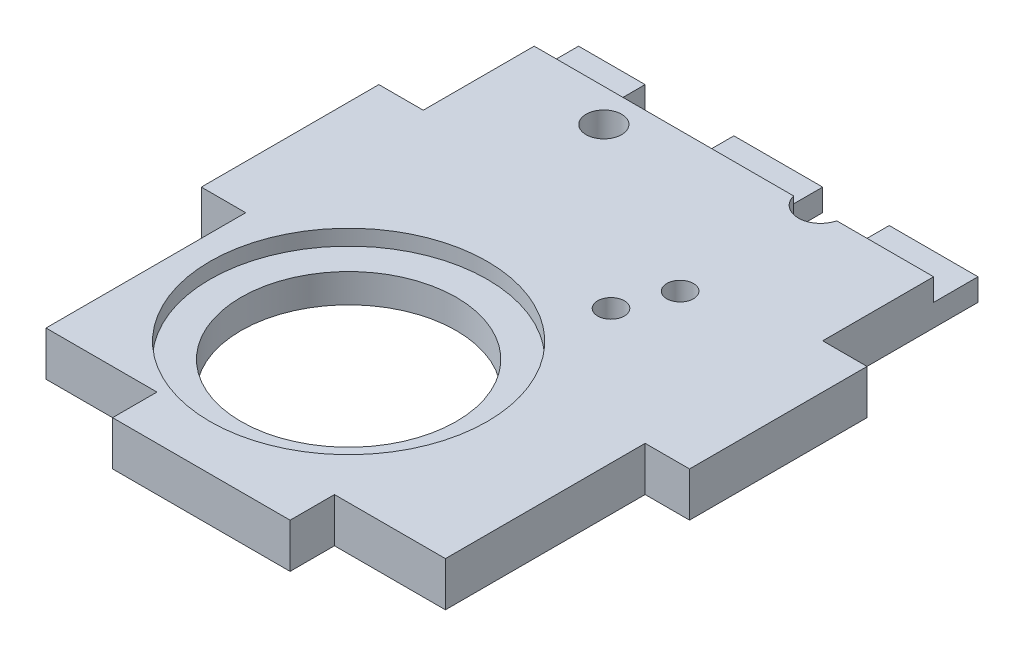
ISO-10303-21;
HEADER;
FILE_DESCRIPTION(('STEP AP214'),'2;1');
FILE_NAME('part.step','',(''),(''),'','','');
FILE_SCHEMA(('AUTOMOTIVE_DESIGN { 1 0 10303 214 1 1 1 1 }'));
ENDSEC;
DATA;
#1=APPLICATION_CONTEXT('core data for automotive mechanical design processes');
#2=APPLICATION_PROTOCOL_DEFINITION('international standard','automotive_design',2000,#1);
#3=PRODUCT_CONTEXT('',#1,'mechanical');
#4=PRODUCT('Part','Part','',(#3));
#5=PRODUCT_RELATED_PRODUCT_CATEGORY('part','',(#4));
#6=PRODUCT_DEFINITION_FORMATION('','',#4);
#7=PRODUCT_DEFINITION_CONTEXT('part definition',#1,'design');
#8=PRODUCT_DEFINITION('design','',#6,#7);
#9=PRODUCT_DEFINITION_SHAPE('','',#8);
#10=(LENGTH_UNIT() NAMED_UNIT(*) SI_UNIT(.MILLI.,.METRE.));
#11=(NAMED_UNIT(*) PLANE_ANGLE_UNIT() SI_UNIT($,.RADIAN.));
#12=(NAMED_UNIT(*) SI_UNIT($,.STERADIAN.) SOLID_ANGLE_UNIT());
#13=UNCERTAINTY_MEASURE_WITH_UNIT(LENGTH_MEASURE(1.E-05),#10,'distance_accuracy_value','');
#14=(GEOMETRIC_REPRESENTATION_CONTEXT(3) GLOBAL_UNCERTAINTY_ASSIGNED_CONTEXT((#13)) GLOBAL_UNIT_ASSIGNED_CONTEXT((#10,
#11,#12)) REPRESENTATION_CONTEXT('',''));
#15=CARTESIAN_POINT('',(0.,0.,0.));
#16=DIRECTION('',(0.,0.,1.));
#17=DIRECTION('',(1.,0.,0.));
#18=AXIS2_PLACEMENT_3D('',#15,#16,#17);
#19=CARTESIAN_POINT('',(0.,10.,-110.));
#20=DIRECTION('',(0.,0.,-1.));
#21=DIRECTION('',(-1.,0.,0.));
#22=AXIS2_PLACEMENT_3D('',#19,#20,#21);
#23=PLANE('',#22);
#24=DIRECTION('',(1.,0.,0.));
#25=VECTOR('',#24,1.);
#26=CARTESIAN_POINT('',(0.,0.,-110.));
#27=LINE('',#26,#25);
#28=CARTESIAN_POINT('',(55.,0.,-110.));
#29=VERTEX_POINT('',#28);
#30=CARTESIAN_POINT('',(58.4634265127102,0.,-110.));
#31=VERTEX_POINT('',#30);
#32=EDGE_CURVE('E390',#29,#31,#27,.T.);
#33=ORIENTED_EDGE('',*,*,#32,.F.);
#34=DIRECTION('',(0.,-1.,0.));
#35=VECTOR('',#34,1.);
#36=CARTESIAN_POINT('',(55.,0.,-110.));
#37=LINE('',#36,#35);
#38=CARTESIAN_POINT('',(55.,5.,-110.));
#39=VERTEX_POINT('',#38);
#40=EDGE_CURVE('E50',#39,#29,#37,.T.);
#41=ORIENTED_EDGE('',*,*,#40,.F.);
#42=DIRECTION('',(1.,0.,0.));
#43=VECTOR('',#42,1.);
#44=CARTESIAN_POINT('',(55.,5.,-110.));
#45=LINE('',#44,#43);
#46=CARTESIAN_POINT('',(35.,5.,-110.));
#47=VERTEX_POINT('',#46);
#48=EDGE_CURVE('E238',#47,#39,#45,.T.);
#49=ORIENTED_EDGE('',*,*,#48,.F.);
#50=DIRECTION('',(0.,1.,0.));
#51=VECTOR('',#50,1.);
#52=CARTESIAN_POINT('',(35.,0.,-110.));
#53=LINE('',#52,#51);
#54=CARTESIAN_POINT('',(35.,0.,-110.));
#55=VERTEX_POINT('',#54);
#56=EDGE_CURVE('E481',#55,#47,#53,.T.);
#57=ORIENTED_EDGE('',*,*,#56,.F.);
#58=CARTESIAN_POINT('',(15.,0.,-110.));
#59=VERTEX_POINT('',#58);
#60=EDGE_CURVE('E387',#59,#55,#27,.T.);
#61=ORIENTED_EDGE('',*,*,#60,.F.);
#62=DIRECTION('',(0.,-1.,0.));
#63=VECTOR('',#62,1.);
#64=CARTESIAN_POINT('',(15.,0.,-110.));
#65=LINE('',#64,#63);
#66=CARTESIAN_POINT('',(15.,5.,-110.));
#67=VERTEX_POINT('',#66);
#68=EDGE_CURVE('E243',#67,#59,#65,.T.);
#69=ORIENTED_EDGE('',*,*,#68,.F.);
#70=DIRECTION('',(1.,0.,0.));
#71=VECTOR('',#70,1.);
#72=CARTESIAN_POINT('',(0.,5.,-110.));
#73=LINE('',#72,#71);
#74=CARTESIAN_POINT('',(0.,5.,-110.));
#75=VERTEX_POINT('',#74);
#76=EDGE_CURVE('E241',#75,#67,#73,.T.);
#77=ORIENTED_EDGE('',*,*,#76,.F.);
#78=DIRECTION('',(0.,-1.,0.));
#79=VECTOR('',#78,1.);
#80=CARTESIAN_POINT('',(0.,10.,-110.));
#81=LINE('',#80,#79);
#82=CARTESIAN_POINT('',(0.,10.,-110.));
#83=VERTEX_POINT('',#82);
#84=EDGE_CURVE('E412',#83,#75,#81,.T.);
#85=ORIENTED_EDGE('',*,*,#84,.F.);
#86=DIRECTION('',(1.,0.,0.));
#87=VECTOR('',#86,1.);
#88=CARTESIAN_POINT('',(0.,10.,-110.));
#89=LINE('',#88,#87);
#90=CARTESIAN_POINT('',(58.4634265127102,10.,-110.));
#91=VERTEX_POINT('',#90);
#92=EDGE_CURVE('E348',#83,#91,#89,.T.);
#93=ORIENTED_EDGE('',*,*,#92,.T.);
#94=DIRECTION('',(0.,1.,0.));
#95=VECTOR('',#94,1.);
#96=CARTESIAN_POINT('',(58.4634265127102,0.,-110.));
#97=LINE('',#96,#95);
#98=EDGE_CURVE('E291',#31,#91,#97,.T.);
#99=ORIENTED_EDGE('',*,*,#98,.F.);
#100=EDGE_LOOP('',(#33,#41,#49,#57,#61,#69,#77,#85,#93,#99));
#101=FACE_BOUND('',#100,.T.);
#102=ADVANCED_FACE('F35',(#101),#23,.T.);
#103=DIRECTION('',(1.,0.,0.));
#104=VECTOR('',#103,1.);
#105=CARTESIAN_POINT('',(90.,5.,-110.));
#106=LINE('',#105,#104);
#107=CARTESIAN_POINT('',(70.,5.,-110.));
#108=VERTEX_POINT('',#107);
#109=CARTESIAN_POINT('',(90.,5.,-110.));
#110=VERTEX_POINT('',#109);
#111=EDGE_CURVE('E271',#108,#110,#106,.T.);
#112=ORIENTED_EDGE('',*,*,#111,.F.);
#113=DIRECTION('',(0.,1.,0.));
#114=VECTOR('',#113,1.);
#115=CARTESIAN_POINT('',(70.,0.,-110.));
#116=LINE('',#115,#114);
#117=CARTESIAN_POINT('',(70.,0.,-110.));
#118=VERTEX_POINT('',#117);
#119=EDGE_CURVE('E266',#118,#108,#116,.T.);
#120=ORIENTED_EDGE('',*,*,#119,.F.);
#121=CARTESIAN_POINT('',(68.1664088524938,0.,-110.));
#122=VERTEX_POINT('',#121);
#123=EDGE_CURVE('E391',#122,#118,#27,.T.);
#124=ORIENTED_EDGE('',*,*,#123,.F.);
#125=DIRECTION('',(0.,1.,0.));
#126=VECTOR('',#125,1.);
#127=CARTESIAN_POINT('',(68.1664088524938,0.,-110.));
#128=LINE('',#127,#126);
#129=CARTESIAN_POINT('',(68.1664088524938,10.,-110.));
#130=VERTEX_POINT('',#129);
#131=EDGE_CURVE('E289',#130,#122,#128,.F.);
#132=ORIENTED_EDGE('',*,*,#131,.F.);
#133=CARTESIAN_POINT('',(90.,10.,-110.));
#134=VERTEX_POINT('',#133);
#135=EDGE_CURVE('E352',#130,#134,#89,.T.);
#136=ORIENTED_EDGE('',*,*,#135,.T.);
#137=DIRECTION('',(0.,-1.,0.));
#138=VECTOR('',#137,1.);
#139=CARTESIAN_POINT('',(90.,10.,-110.));
#140=LINE('',#139,#138);
#141=EDGE_CURVE('E415',#134,#110,#140,.T.);
#142=ORIENTED_EDGE('',*,*,#141,.T.);
#143=EDGE_LOOP('',(#112,#120,#124,#132,#136,#142));
#144=FACE_BOUND('',#143,.T.);
#145=ADVANCED_FACE('F504',(#144),#23,.T.);
#146=CARTESIAN_POINT('',(0.,10.,0.));
#147=DIRECTION('',(0.,0.,-1.));
#148=DIRECTION('',(-1.,0.,0.));
#149=AXIS2_PLACEMENT_3D('',#146,#147,#148);
#150=PLANE('',#149);
#151=DIRECTION('',(1.,0.,0.));
#152=VECTOR('',#151,1.);
#153=CARTESIAN_POINT('',(0.,0.,0.));
#154=LINE('',#153,#152);
#155=CARTESIAN_POINT('',(0.,0.,0.));
#156=VERTEX_POINT('',#155);
#157=CARTESIAN_POINT('',(25.,0.,0.));
#158=VERTEX_POINT('',#157);
#159=EDGE_CURVE('E321',#156,#158,#154,.T.);
#160=ORIENTED_EDGE('',*,*,#159,.T.);
#161=DIRECTION('',(0.,-1.,0.));
#162=VECTOR('',#161,1.);
#163=CARTESIAN_POINT('',(25.,10.,0.));
#164=LINE('',#163,#162);
#165=CARTESIAN_POINT('',(25.,10.,0.));
#166=VERTEX_POINT('',#165);
#167=EDGE_CURVE('E43',#166,#158,#164,.T.);
#168=ORIENTED_EDGE('',*,*,#167,.F.);
#169=DIRECTION('',(1.,0.,0.));
#170=VECTOR('',#169,1.);
#171=CARTESIAN_POINT('',(0.,10.,0.));
#172=LINE('',#171,#170);
#173=CARTESIAN_POINT('',(0.,10.,0.));
#174=VERTEX_POINT('',#173);
#175=EDGE_CURVE('E324',#174,#166,#172,.T.);
#176=ORIENTED_EDGE('',*,*,#175,.F.);
#177=DIRECTION('',(0.,-1.,0.));
#178=VECTOR('',#177,1.);
#179=CARTESIAN_POINT('',(0.,10.,0.));
#180=LINE('',#179,#178);
#181=EDGE_CURVE('E401',#174,#156,#180,.T.);
#182=ORIENTED_EDGE('',*,*,#181,.T.);
#183=EDGE_LOOP('',(#160,#168,#176,#182));
#184=FACE_BOUND('',#183,.T.);
#185=ADVANCED_FACE('F442',(#184),#150,.F.);
#186=CARTESIAN_POINT('',(25.,10.,0.));
#187=DIRECTION('',(1.,0.,0.));
#188=DIRECTION('',(0.,0.,-1.));
#189=AXIS2_PLACEMENT_3D('',#186,#187,#188);
#190=PLANE('',#189);
#191=DIRECTION('',(0.,0.,1.));
#192=VECTOR('',#191,1.);
#193=CARTESIAN_POINT('',(25.,0.,0.));
#194=LINE('',#193,#192);
#195=CARTESIAN_POINT('',(25.,0.,10.));
#196=VERTEX_POINT('',#195);
#197=EDGE_CURVE('E365',#158,#196,#194,.T.);
#198=ORIENTED_EDGE('',*,*,#197,.T.);
#199=DIRECTION('',(0.,-1.,0.));
#200=VECTOR('',#199,1.);
#201=CARTESIAN_POINT('',(25.,10.,10.));
#202=LINE('',#201,#200);
#203=CARTESIAN_POINT('',(25.,10.,10.));
#204=VERTEX_POINT('',#203);
#205=EDGE_CURVE('E434',#204,#196,#202,.T.);
#206=ORIENTED_EDGE('',*,*,#205,.F.);
#207=DIRECTION('',(0.,0.,1.));
#208=VECTOR('',#207,1.);
#209=CARTESIAN_POINT('',(25.,10.,0.));
#210=LINE('',#209,#208);
#211=EDGE_CURVE('E327',#166,#204,#210,.T.);
#212=ORIENTED_EDGE('',*,*,#211,.F.);
#213=ORIENTED_EDGE('',*,*,#167,.T.);
#214=EDGE_LOOP('',(#198,#206,#212,#213));
#215=FACE_BOUND('',#214,.T.);
#216=ADVANCED_FACE('F37',(#215),#190,.F.);
#217=CARTESIAN_POINT('',(0.,10.,10.));
#218=DIRECTION('',(0.,0.,1.));
#219=DIRECTION('',(1.,0.,0.));
#220=AXIS2_PLACEMENT_3D('',#217,#218,#219);
#221=PLANE('',#220);
#222=DIRECTION('',(-1.,0.,0.));
#223=VECTOR('',#222,1.);
#224=CARTESIAN_POINT('',(0.,0.,10.));
#225=LINE('',#224,#223);
#226=CARTESIAN_POINT('',(65.,0.,10.));
#227=VERTEX_POINT('',#226);
#228=EDGE_CURVE('E369',#227,#196,#225,.T.);
#229=ORIENTED_EDGE('',*,*,#228,.F.);
#230=DIRECTION('',(0.,-1.,0.));
#231=VECTOR('',#230,1.);
#232=CARTESIAN_POINT('',(65.,10.,10.));
#233=LINE('',#232,#231);
#234=CARTESIAN_POINT('',(65.,10.,10.));
#235=VERTEX_POINT('',#234);
#236=EDGE_CURVE('E432',#235,#227,#233,.T.);
#237=ORIENTED_EDGE('',*,*,#236,.F.);
#238=DIRECTION('',(-1.,0.,0.));
#239=VECTOR('',#238,1.);
#240=CARTESIAN_POINT('',(0.,10.,10.));
#241=LINE('',#240,#239);
#242=EDGE_CURVE('E331',#235,#204,#241,.T.);
#243=ORIENTED_EDGE('',*,*,#242,.T.);
#244=ORIENTED_EDGE('',*,*,#205,.T.);
#245=EDGE_LOOP('',(#229,#237,#243,#244));
#246=FACE_BOUND('',#245,.T.);
#247=ADVANCED_FACE('F536',(#246),#221,.T.);
#248=CARTESIAN_POINT('',(65.,10.,0.));
#249=DIRECTION('',(1.,0.,0.));
#250=DIRECTION('',(0.,0.,-1.));
#251=AXIS2_PLACEMENT_3D('',#248,#249,#250);
#252=PLANE('',#251);
#253=DIRECTION('',(0.,0.,1.));
#254=VECTOR('',#253,1.);
#255=CARTESIAN_POINT('',(65.,0.,0.));
#256=LINE('',#255,#254);
#257=CARTESIAN_POINT('',(65.,0.,0.));
#258=VERTEX_POINT('',#257);
#259=EDGE_CURVE('E372',#258,#227,#256,.T.);
#260=ORIENTED_EDGE('',*,*,#259,.F.);
#261=DIRECTION('',(0.,-1.,0.));
#262=VECTOR('',#261,1.);
#263=CARTESIAN_POINT('',(65.,10.,0.));
#264=LINE('',#263,#262);
#265=CARTESIAN_POINT('',(65.,10.,0.));
#266=VERTEX_POINT('',#265);
#267=EDGE_CURVE('E430',#266,#258,#264,.T.);
#268=ORIENTED_EDGE('',*,*,#267,.F.);
#269=DIRECTION('',(0.,0.,1.));
#270=VECTOR('',#269,1.);
#271=CARTESIAN_POINT('',(65.,10.,0.));
#272=LINE('',#271,#270);
#273=EDGE_CURVE('E334',#266,#235,#272,.T.);
#274=ORIENTED_EDGE('',*,*,#273,.T.);
#275=ORIENTED_EDGE('',*,*,#236,.T.);
#276=EDGE_LOOP('',(#260,#268,#274,#275));
#277=FACE_BOUND('',#276,.T.);
#278=ADVANCED_FACE('F533',(#277),#252,.T.);
#279=CARTESIAN_POINT('',(90.,0.,0.));
#280=VERTEX_POINT('',#279);
#281=EDGE_CURVE('E366',#258,#280,#154,.T.);
#282=ORIENTED_EDGE('',*,*,#281,.T.);
#283=DIRECTION('',(0.,-1.,0.));
#284=VECTOR('',#283,1.);
#285=CARTESIAN_POINT('',(90.,10.,0.));
#286=LINE('',#285,#284);
#287=CARTESIAN_POINT('',(90.,10.,0.));
#288=VERTEX_POINT('',#287);
#289=EDGE_CURVE('E427',#288,#280,#286,.T.);
#290=ORIENTED_EDGE('',*,*,#289,.F.);
#291=EDGE_CURVE('E329',#266,#288,#172,.T.);
#292=ORIENTED_EDGE('',*,*,#291,.F.);
#293=ORIENTED_EDGE('',*,*,#267,.T.);
#294=EDGE_LOOP('',(#282,#290,#292,#293));
#295=FACE_BOUND('',#294,.T.);
#296=ADVANCED_FACE('F530',(#295),#150,.F.);
#297=CARTESIAN_POINT('',(90.,10.,0.));
#298=DIRECTION('',(-1.,0.,0.));
#299=DIRECTION('',(0.,0.,1.));
#300=AXIS2_PLACEMENT_3D('',#297,#298,#299);
#301=PLANE('',#300);
#302=DIRECTION('',(0.,0.,-1.));
#303=VECTOR('',#302,1.);
#304=CARTESIAN_POINT('',(90.,0.,0.));
#305=LINE('',#304,#303);
#306=CARTESIAN_POINT('',(90.,0.,-45.));
#307=VERTEX_POINT('',#306);
#308=EDGE_CURVE('E375',#280,#307,#305,.T.);
#309=ORIENTED_EDGE('',*,*,#308,.T.);
#310=DIRECTION('',(0.,-1.,0.));
#311=VECTOR('',#310,1.);
#312=CARTESIAN_POINT('',(90.,10.,-45.));
#313=LINE('',#312,#311);
#314=CARTESIAN_POINT('',(90.,10.,-45.));
#315=VERTEX_POINT('',#314);
#316=EDGE_CURVE('E424',#315,#307,#313,.T.);
#317=ORIENTED_EDGE('',*,*,#316,.F.);
#318=DIRECTION('',(0.,0.,-1.));
#319=VECTOR('',#318,1.);
#320=CARTESIAN_POINT('',(90.,10.,0.));
#321=LINE('',#320,#319);
#322=EDGE_CURVE('E337',#288,#315,#321,.T.);
#323=ORIENTED_EDGE('',*,*,#322,.F.);
#324=ORIENTED_EDGE('',*,*,#289,.T.);
#325=EDGE_LOOP('',(#309,#317,#323,#324));
#326=FACE_BOUND('',#325,.T.);
#327=ADVANCED_FACE('F518',(#326),#301,.F.);
#328=CARTESIAN_POINT('',(0.,10.,-45.));
#329=DIRECTION('',(0.,0.,-1.));
#330=DIRECTION('',(-1.,0.,0.));
#331=AXIS2_PLACEMENT_3D('',#328,#329,#330);
#332=PLANE('',#331);
#333=DIRECTION('',(1.,0.,0.));
#334=VECTOR('',#333,1.);
#335=CARTESIAN_POINT('',(0.,0.,-45.));
#336=LINE('',#335,#334);
#337=CARTESIAN_POINT('',(100.,0.,-45.));
#338=VERTEX_POINT('',#337);
#339=EDGE_CURVE('E377',#307,#338,#336,.T.);
#340=ORIENTED_EDGE('',*,*,#339,.T.);
#341=DIRECTION('',(0.,-1.,0.));
#342=VECTOR('',#341,1.);
#343=CARTESIAN_POINT('',(100.,10.,-45.));
#344=LINE('',#343,#342);
#345=CARTESIAN_POINT('',(100.,10.,-45.));
#346=VERTEX_POINT('',#345);
#347=EDGE_CURVE('E422',#346,#338,#344,.T.);
#348=ORIENTED_EDGE('',*,*,#347,.F.);
#349=DIRECTION('',(1.,0.,0.));
#350=VECTOR('',#349,1.);
#351=CARTESIAN_POINT('',(0.,10.,-45.));
#352=LINE('',#351,#350);
#353=EDGE_CURVE('E339',#315,#346,#352,.T.);
#354=ORIENTED_EDGE('',*,*,#353,.F.);
#355=ORIENTED_EDGE('',*,*,#316,.T.);
#356=EDGE_LOOP('',(#340,#348,#354,#355));
#357=FACE_BOUND('',#356,.T.);
#358=ADVANCED_FACE('F525',(#357),#332,.F.);
#359=CARTESIAN_POINT('',(100.,10.,0.));
#360=DIRECTION('',(1.,0.,0.));
#361=DIRECTION('',(0.,0.,-1.));
#362=AXIS2_PLACEMENT_3D('',#359,#360,#361);
#363=PLANE('',#362);
#364=DIRECTION('',(0.,0.,1.));
#365=VECTOR('',#364,1.);
#366=CARTESIAN_POINT('',(100.,0.,0.));
#367=LINE('',#366,#365);
#368=CARTESIAN_POINT('',(100.,0.,-85.));
#369=VERTEX_POINT('',#368);
#370=EDGE_CURVE('E381',#369,#338,#367,.T.);
#371=ORIENTED_EDGE('',*,*,#370,.F.);
#372=DIRECTION('',(0.,-1.,0.));
#373=VECTOR('',#372,1.);
#374=CARTESIAN_POINT('',(100.,10.,-85.));
#375=LINE('',#374,#373);
#376=CARTESIAN_POINT('',(100.,10.,-85.));
#377=VERTEX_POINT('',#376);
#378=EDGE_CURVE('E420',#377,#369,#375,.T.);
#379=ORIENTED_EDGE('',*,*,#378,.F.);
#380=DIRECTION('',(0.,0.,1.));
#381=VECTOR('',#380,1.);
#382=CARTESIAN_POINT('',(100.,10.,0.));
#383=LINE('',#382,#381);
#384=EDGE_CURVE('E342',#377,#346,#383,.T.);
#385=ORIENTED_EDGE('',*,*,#384,.T.);
#386=ORIENTED_EDGE('',*,*,#347,.T.);
#387=EDGE_LOOP('',(#371,#379,#385,#386));
#388=FACE_BOUND('',#387,.T.);
#389=ADVANCED_FACE('F521',(#388),#363,.T.);
#390=CARTESIAN_POINT('',(1.17961196366423E-13,10.,-85.0000000000001));
#391=DIRECTION('',(0.,0.,-1.));
#392=DIRECTION('',(-1.,0.,0.));
#393=AXIS2_PLACEMENT_3D('',#390,#391,#392);
#394=PLANE('',#393);
#395=DIRECTION('',(1.,0.,0.));
#396=VECTOR('',#395,1.);
#397=CARTESIAN_POINT('',(1.17961196366423E-13,0.,-85.0000000000001));
#398=LINE('',#397,#396);
#399=CARTESIAN_POINT('',(90.,0.,-85.));
#400=VERTEX_POINT('',#399);
#401=EDGE_CURVE('E384',#400,#369,#398,.T.);
#402=ORIENTED_EDGE('',*,*,#401,.F.);
#403=DIRECTION('',(0.,-1.,0.));
#404=VECTOR('',#403,1.);
#405=CARTESIAN_POINT('',(90.,10.,-85.));
#406=LINE('',#405,#404);
#407=CARTESIAN_POINT('',(90.,10.,-85.));
#408=VERTEX_POINT('',#407);
#409=EDGE_CURVE('E418',#408,#400,#406,.T.);
#410=ORIENTED_EDGE('',*,*,#409,.F.);
#411=DIRECTION('',(1.,0.,0.));
#412=VECTOR('',#411,1.);
#413=CARTESIAN_POINT('',(1.17961196366423E-13,10.,-85.0000000000001));
#414=LINE('',#413,#412);
#415=EDGE_CURVE('E345',#408,#377,#414,.T.);
#416=ORIENTED_EDGE('',*,*,#415,.T.);
#417=ORIENTED_EDGE('',*,*,#378,.T.);
#418=EDGE_LOOP('',(#402,#410,#416,#417));
#419=FACE_BOUND('',#418,.T.);
#420=ADVANCED_FACE('F516',(#419),#394,.T.);
#421=CARTESIAN_POINT('',(90.,0.,-120.));
#422=VERTEX_POINT('',#421);
#423=EDGE_CURVE('E378',#400,#422,#305,.T.);
#424=ORIENTED_EDGE('',*,*,#423,.T.);
#425=DIRECTION('',(0.,-1.,0.));
#426=VECTOR('',#425,1.);
#427=CARTESIAN_POINT('',(90.,0.,-120.));
#428=LINE('',#427,#426);
#429=CARTESIAN_POINT('',(90.,5.,-120.));
#430=VERTEX_POINT('',#429);
#431=EDGE_CURVE('E267',#430,#422,#428,.T.);
#432=ORIENTED_EDGE('',*,*,#431,.F.);
#433=DIRECTION('',(0.,0.,1.));
#434=VECTOR('',#433,1.);
#435=CARTESIAN_POINT('',(90.,5.,-120.));
#436=LINE('',#435,#434);
#437=EDGE_CURVE('E277',#430,#110,#436,.T.);
#438=ORIENTED_EDGE('',*,*,#437,.T.);
#439=ORIENTED_EDGE('',*,*,#141,.F.);
#440=EDGE_CURVE('E340',#408,#134,#321,.T.);
#441=ORIENTED_EDGE('',*,*,#440,.F.);
#442=ORIENTED_EDGE('',*,*,#409,.T.);
#443=EDGE_LOOP('',(#424,#432,#438,#439,#441,#442));
#444=FACE_BOUND('',#443,.T.);
#445=ADVANCED_FACE('F513',(#444),#301,.F.);
#446=CARTESIAN_POINT('',(0.,10.,0.));
#447=DIRECTION('',(-1.,0.,0.));
#448=DIRECTION('',(0.,0.,1.));
#449=AXIS2_PLACEMENT_3D('',#446,#447,#448);
#450=PLANE('',#449);
#451=DIRECTION('',(0.,0.,-1.));
#452=VECTOR('',#451,1.);
#453=CARTESIAN_POINT('',(0.,0.,0.));
#454=LINE('',#453,#452);
#455=CARTESIAN_POINT('',(0.,0.,-85.));
#456=VERTEX_POINT('',#455);
#457=CARTESIAN_POINT('',(0.,0.,-120.));
#458=VERTEX_POINT('',#457);
#459=EDGE_CURVE('E389',#456,#458,#454,.T.);
#460=ORIENTED_EDGE('',*,*,#459,.F.);
#461=DIRECTION('',(0.,-1.,0.));
#462=VECTOR('',#461,1.);
#463=CARTESIAN_POINT('',(0.,10.,-85.));
#464=LINE('',#463,#462);
#465=CARTESIAN_POINT('',(0.,10.,-85.));
#466=VERTEX_POINT('',#465);
#467=EDGE_CURVE('E410',#466,#456,#464,.T.);
#468=ORIENTED_EDGE('',*,*,#467,.F.);
#469=DIRECTION('',(0.,0.,-1.));
#470=VECTOR('',#469,1.);
#471=CARTESIAN_POINT('',(0.,10.,0.));
#472=LINE('',#471,#470);
#473=EDGE_CURVE('E351',#466,#83,#472,.T.);
#474=ORIENTED_EDGE('',*,*,#473,.T.);
#475=ORIENTED_EDGE('',*,*,#84,.T.);
#476=DIRECTION('',(0.,0.,1.));
#477=VECTOR('',#476,1.);
#478=CARTESIAN_POINT('',(0.,5.,-120.));
#479=LINE('',#478,#477);
#480=CARTESIAN_POINT('',(0.,5.,-120.));
#481=VERTEX_POINT('',#480);
#482=EDGE_CURVE('E264',#481,#75,#479,.T.);
#483=ORIENTED_EDGE('',*,*,#482,.F.);
#484=DIRECTION('',(0.,1.,0.));
#485=VECTOR('',#484,1.);
#486=CARTESIAN_POINT('',(0.,0.,-120.));
#487=LINE('',#486,#485);
#488=EDGE_CURVE('E249',#458,#481,#487,.T.);
#489=ORIENTED_EDGE('',*,*,#488,.F.);
#490=EDGE_LOOP('',(#460,#468,#474,#475,#483,#489));
#491=FACE_BOUND('',#490,.T.);
#492=ADVANCED_FACE('F466',(#491),#450,.T.);
#493=CARTESIAN_POINT('',(1.17961196366423E-13,10.,-85.));
#494=DIRECTION('',(0.,0.,1.));
#495=DIRECTION('',(1.,0.,0.));
#496=AXIS2_PLACEMENT_3D('',#493,#494,#495);
#497=PLANE('',#496);
#498=DIRECTION('',(-1.,0.,0.));
#499=VECTOR('',#498,1.);
#500=CARTESIAN_POINT('',(1.17961196366423E-13,0.,-85.));
#501=LINE('',#500,#499);
#502=CARTESIAN_POINT('',(-9.99999999999999,0.,-85.));
#503=VERTEX_POINT('',#502);
#504=EDGE_CURVE('E393',#456,#503,#501,.T.);
#505=ORIENTED_EDGE('',*,*,#504,.T.);
#506=DIRECTION('',(0.,-1.,0.));
#507=VECTOR('',#506,1.);
#508=CARTESIAN_POINT('',(-9.99999999999999,10.,-85.));
#509=LINE('',#508,#507);
#510=CARTESIAN_POINT('',(-9.99999999999999,10.,-85.));
#511=VERTEX_POINT('',#510);
#512=EDGE_CURVE('E407',#511,#503,#509,.T.);
#513=ORIENTED_EDGE('',*,*,#512,.F.);
#514=DIRECTION('',(-1.,0.,0.));
#515=VECTOR('',#514,1.);
#516=CARTESIAN_POINT('',(1.17961196366423E-13,10.,-85.));
#517=LINE('',#516,#515);
#518=EDGE_CURVE('E355',#466,#511,#517,.T.);
#519=ORIENTED_EDGE('',*,*,#518,.F.);
#520=ORIENTED_EDGE('',*,*,#467,.T.);
#521=EDGE_LOOP('',(#505,#513,#519,#520));
#522=FACE_BOUND('',#521,.T.);
#523=ADVANCED_FACE('F463',(#522),#497,.F.);
#524=CARTESIAN_POINT('',(-9.99999999999999,10.,0.));
#525=DIRECTION('',(1.,0.,0.));
#526=DIRECTION('',(0.,0.,-1.));
#527=AXIS2_PLACEMENT_3D('',#524,#525,#526);
#528=PLANE('',#527);
#529=DIRECTION('',(0.,0.,1.));
#530=VECTOR('',#529,1.);
#531=CARTESIAN_POINT('',(-9.99999999999999,0.,0.));
#532=LINE('',#531,#530);
#533=CARTESIAN_POINT('',(-9.99999999999999,0.,-45.));
#534=VERTEX_POINT('',#533);
#535=EDGE_CURVE('E395',#503,#534,#532,.T.);
#536=ORIENTED_EDGE('',*,*,#535,.T.);
#537=DIRECTION('',(0.,-1.,0.));
#538=VECTOR('',#537,1.);
#539=CARTESIAN_POINT('',(-9.99999999999999,10.,-45.));
#540=LINE('',#539,#538);
#541=CARTESIAN_POINT('',(-9.99999999999999,10.,-45.));
#542=VERTEX_POINT('',#541);
#543=EDGE_CURVE('E405',#542,#534,#540,.T.);
#544=ORIENTED_EDGE('',*,*,#543,.F.);
#545=DIRECTION('',(0.,0.,1.));
#546=VECTOR('',#545,1.);
#547=CARTESIAN_POINT('',(-9.99999999999999,10.,0.));
#548=LINE('',#547,#546);
#549=EDGE_CURVE('E358',#511,#542,#548,.T.);
#550=ORIENTED_EDGE('',*,*,#549,.F.);
#551=ORIENTED_EDGE('',*,*,#512,.T.);
#552=EDGE_LOOP('',(#536,#544,#550,#551));
#553=FACE_BOUND('',#552,.T.);
#554=ADVANCED_FACE('F458',(#553),#528,.F.);
#555=CARTESIAN_POINT('',(0.,10.,-45.));
#556=DIRECTION('',(0.,0.,1.));
#557=DIRECTION('',(1.,0.,0.));
#558=AXIS2_PLACEMENT_3D('',#555,#556,#557);
#559=PLANE('',#558);
#560=DIRECTION('',(-1.,0.,0.));
#561=VECTOR('',#560,1.);
#562=CARTESIAN_POINT('',(0.,0.,-45.));
#563=LINE('',#562,#561);
#564=CARTESIAN_POINT('',(0.,0.,-45.));
#565=VERTEX_POINT('',#564);
#566=EDGE_CURVE('E398',#565,#534,#563,.T.);
#567=ORIENTED_EDGE('',*,*,#566,.F.);
#568=DIRECTION('',(0.,-1.,0.));
#569=VECTOR('',#568,1.);
#570=CARTESIAN_POINT('',(0.,10.,-45.));
#571=LINE('',#570,#569);
#572=CARTESIAN_POINT('',(0.,10.,-45.));
#573=VERTEX_POINT('',#572);
#574=EDGE_CURVE('E403',#573,#565,#571,.T.);
#575=ORIENTED_EDGE('',*,*,#574,.F.);
#576=DIRECTION('',(-1.,0.,0.));
#577=VECTOR('',#576,1.);
#578=CARTESIAN_POINT('',(0.,10.,-45.));
#579=LINE('',#578,#577);
#580=EDGE_CURVE('E360',#573,#542,#579,.T.);
#581=ORIENTED_EDGE('',*,*,#580,.T.);
#582=ORIENTED_EDGE('',*,*,#543,.T.);
#583=EDGE_LOOP('',(#567,#575,#581,#582));
#584=FACE_BOUND('',#583,.T.);
#585=ADVANCED_FACE('F452',(#584),#559,.T.);
#586=EDGE_CURVE('E328',#156,#565,#454,.T.);
#587=ORIENTED_EDGE('',*,*,#586,.F.);
#588=ORIENTED_EDGE('',*,*,#181,.F.);
#589=EDGE_CURVE('E356',#174,#573,#472,.T.);
#590=ORIENTED_EDGE('',*,*,#589,.T.);
#591=ORIENTED_EDGE('',*,*,#574,.T.);
#592=EDGE_LOOP('',(#587,#588,#590,#591));
#593=FACE_BOUND('',#592,.T.);
#594=ADVANCED_FACE('F446',(#593),#450,.T.);
#595=CARTESIAN_POINT('',(0.,10.,0.));
#596=DIRECTION('',(0.,1.,0.));
#597=DIRECTION('',(0.,0.,1.));
#598=AXIS2_PLACEMENT_3D('',#595,#596,#597);
#599=PLANE('',#598);
#600=CARTESIAN_POINT('',(63.314917682602,10.,-111.209559187664));
#601=DIRECTION('',(0.,1.,0.));
#602=DIRECTION('',(0.,0.,1.));
#603=AXIS2_PLACEMENT_3D('',#600,#601,#602);
#604=CIRCLE('',#603,5.00000000000001);
#605=EDGE_CURVE('E287',#91,#130,#604,.T.);
#606=ORIENTED_EDGE('',*,*,#605,.F.);
#607=ORIENTED_EDGE('',*,*,#92,.F.);
#608=ORIENTED_EDGE('',*,*,#473,.F.);
#609=ORIENTED_EDGE('',*,*,#518,.T.);
#610=ORIENTED_EDGE('',*,*,#549,.T.);
#611=ORIENTED_EDGE('',*,*,#580,.F.);
#612=ORIENTED_EDGE('',*,*,#589,.F.);
#613=ORIENTED_EDGE('',*,*,#175,.T.);
#614=ORIENTED_EDGE('',*,*,#211,.T.);
#615=ORIENTED_EDGE('',*,*,#242,.F.);
#616=ORIENTED_EDGE('',*,*,#273,.F.);
#617=ORIENTED_EDGE('',*,*,#291,.T.);
#618=ORIENTED_EDGE('',*,*,#322,.T.);
#619=ORIENTED_EDGE('',*,*,#353,.T.);
#620=ORIENTED_EDGE('',*,*,#384,.F.);
#621=ORIENTED_EDGE('',*,*,#415,.F.);
#622=ORIENTED_EDGE('',*,*,#440,.T.);
#623=ORIENTED_EDGE('',*,*,#135,.F.);
#624=EDGE_LOOP('',(#606,#607,#608,#609,#610,#611,#612,#613,#614,#615,#616,#617,#618,#619,#620,
#621,#622,#623));
#625=FACE_BOUND('',#624,.T.);
#626=CARTESIAN_POINT('',(36.72,10.,-31.47));
#627=DIRECTION('',(0.,1.,0.));
#628=DIRECTION('',(0.,0.,1.));
#629=AXIS2_PLACEMENT_3D('',#626,#627,#628);
#630=CIRCLE('',#629,31.25);
#631=CARTESIAN_POINT('',(36.72,10.,-0.219999999999984));
#632=VERTEX_POINT('',#631);
#633=EDGE_CURVE('E297',#632,#632,#630,.T.);
#634=ORIENTED_EDGE('',*,*,#633,.F.);
#635=EDGE_LOOP('',(#634));
#636=FACE_BOUND('',#635,.T.);
#637=CARTESIAN_POINT('',(64.2471009673165,10.,-78.6365210319121));
#638=DIRECTION('',(0.,1.,0.));
#639=DIRECTION('',(0.,0.,1.));
#640=AXIS2_PLACEMENT_3D('',#637,#638,#639);
#641=CIRCLE('',#640,3.00000000000001);
#642=CARTESIAN_POINT('',(64.2471009673165,10.,-75.6365210319121));
#643=VERTEX_POINT('',#642);
#644=EDGE_CURVE('E310',#643,#643,#641,.T.);
#645=ORIENTED_EDGE('',*,*,#644,.F.);
#646=EDGE_LOOP('',(#645));
#647=FACE_BOUND('',#646,.T.);
#648=CARTESIAN_POINT('',(59.8275943812254,10.,-67.48));
#649=DIRECTION('',(0.,1.,0.));
#650=DIRECTION('',(0.,0.,1.));
#651=AXIS2_PLACEMENT_3D('',#648,#649,#650);
#652=CIRCLE('',#651,3.00000000000001);
#653=CARTESIAN_POINT('',(59.8275943812254,10.,-64.48));
#654=VERTEX_POINT('',#653);
#655=EDGE_CURVE('E303',#654,#654,#652,.T.);
#656=ORIENTED_EDGE('',*,*,#655,.F.);
#657=EDGE_LOOP('',(#656));
#658=FACE_BOUND('',#657,.T.);
#659=CARTESIAN_POINT('',(23.122776972393,10.,-102.57));
#660=DIRECTION('',(0.,1.,0.));
#661=DIRECTION('',(0.,0.,1.));
#662=AXIS2_PLACEMENT_3D('',#659,#660,#661);
#663=CIRCLE('',#662,4.);
#664=CARTESIAN_POINT('',(23.122776972393,10.,-98.57));
#665=VERTEX_POINT('',#664);
#666=EDGE_CURVE('E309',#665,#665,#663,.T.);
#667=ORIENTED_EDGE('',*,*,#666,.F.);
#668=EDGE_LOOP('',(#667));
#669=FACE_BOUND('',#668,.T.);
#670=ADVANCED_FACE('F552',(#625,#636,#647,#658,#669),#599,.T.);
#671=CARTESIAN_POINT('',(0.,0.,0.));
#672=DIRECTION('',(0.,1.,0.));
#673=DIRECTION('',(0.,0.,1.));
#674=AXIS2_PLACEMENT_3D('',#671,#672,#673);
#675=PLANE('',#674);
#676=CARTESIAN_POINT('',(36.72,0.,-31.47));
#677=DIRECTION('',(0.,1.,0.));
#678=DIRECTION('',(0.,0.,1.));
#679=AXIS2_PLACEMENT_3D('',#676,#677,#678);
#680=CIRCLE('',#679,24.25);
#681=CARTESIAN_POINT('',(36.72,0.,-7.21999999999998));
#682=VERTEX_POINT('',#681);
#683=EDGE_CURVE('E294',#682,#682,#680,.T.);
#684=ORIENTED_EDGE('',*,*,#683,.T.);
#685=EDGE_LOOP('',(#684));
#686=FACE_BOUND('',#685,.T.);
#687=CARTESIAN_POINT('',(64.2471009673165,0.,-78.6365210319121));
#688=DIRECTION('',(0.,1.,0.));
#689=DIRECTION('',(0.,0.,1.));
#690=AXIS2_PLACEMENT_3D('',#687,#688,#689);
#691=CIRCLE('',#690,3.00000000000001);
#692=CARTESIAN_POINT('',(64.2471009673165,0.,-75.6365210319121));
#693=VERTEX_POINT('',#692);
#694=EDGE_CURVE('E306',#693,#693,#691,.T.);
#695=ORIENTED_EDGE('',*,*,#694,.T.);
#696=EDGE_LOOP('',(#695));
#697=FACE_BOUND('',#696,.T.);
#698=CARTESIAN_POINT('',(59.8275943812254,0.,-67.48));
#699=DIRECTION('',(0.,1.,0.));
#700=DIRECTION('',(0.,0.,1.));
#701=AXIS2_PLACEMENT_3D('',#698,#699,#700);
#702=CIRCLE('',#701,3.00000000000001);
#703=CARTESIAN_POINT('',(59.8275943812254,0.,-64.48));
#704=VERTEX_POINT('',#703);
#705=EDGE_CURVE('E313',#704,#704,#702,.T.);
#706=ORIENTED_EDGE('',*,*,#705,.T.);
#707=EDGE_LOOP('',(#706));
#708=FACE_BOUND('',#707,.T.);
#709=CARTESIAN_POINT('',(23.122776972393,0.,-102.57));
#710=DIRECTION('',(0.,1.,0.));
#711=DIRECTION('',(0.,0.,1.));
#712=AXIS2_PLACEMENT_3D('',#709,#710,#711);
#713=CIRCLE('',#712,4.);
#714=CARTESIAN_POINT('',(23.122776972393,0.,-98.57));
#715=VERTEX_POINT('',#714);
#716=EDGE_CURVE('E318',#715,#715,#713,.T.);
#717=ORIENTED_EDGE('',*,*,#716,.T.);
#718=EDGE_LOOP('',(#717));
#719=FACE_BOUND('',#718,.T.);
#720=ORIENTED_EDGE('',*,*,#459,.T.);
#721=DIRECTION('',(-1.,0.,0.));
#722=VECTOR('',#721,1.);
#723=CARTESIAN_POINT('',(0.,0.,-120.));
#724=LINE('',#723,#722);
#725=CARTESIAN_POINT('',(15.,0.,-120.));
#726=VERTEX_POINT('',#725);
#727=EDGE_CURVE('E256',#726,#458,#724,.T.);
#728=ORIENTED_EDGE('',*,*,#727,.F.);
#729=DIRECTION('',(0.,0.,1.));
#730=VECTOR('',#729,1.);
#731=CARTESIAN_POINT('',(15.,0.,-120.));
#732=LINE('',#731,#730);
#733=EDGE_CURVE('E58',#726,#59,#732,.T.);
#734=ORIENTED_EDGE('',*,*,#733,.T.);
#735=ORIENTED_EDGE('',*,*,#60,.T.);
#736=DIRECTION('',(0.,0.,1.));
#737=VECTOR('',#736,1.);
#738=CARTESIAN_POINT('',(35.,0.,-120.));
#739=LINE('',#738,#737);
#740=CARTESIAN_POINT('',(35.,0.,-120.));
#741=VERTEX_POINT('',#740);
#742=EDGE_CURVE('E227',#741,#55,#739,.T.);
#743=ORIENTED_EDGE('',*,*,#742,.F.);
#744=DIRECTION('',(-1.,0.,0.));
#745=VECTOR('',#744,1.);
#746=CARTESIAN_POINT('',(55.,0.,-120.));
#747=LINE('',#746,#745);
#748=CARTESIAN_POINT('',(55.,0.,-120.));
#749=VERTEX_POINT('',#748);
#750=EDGE_CURVE('E222',#749,#741,#747,.T.);
#751=ORIENTED_EDGE('',*,*,#750,.F.);
#752=DIRECTION('',(0.,0.,1.));
#753=VECTOR('',#752,1.);
#754=CARTESIAN_POINT('',(55.,0.,-120.));
#755=LINE('',#754,#753);
#756=EDGE_CURVE('E225',#749,#29,#755,.T.);
#757=ORIENTED_EDGE('',*,*,#756,.T.);
#758=ORIENTED_EDGE('',*,*,#32,.T.);
#759=CARTESIAN_POINT('',(63.314917682602,0.,-111.209559187664));
#760=DIRECTION('',(0.,1.,0.));
#761=DIRECTION('',(0.,0.,1.));
#762=AXIS2_PLACEMENT_3D('',#759,#760,#761);
#763=CIRCLE('',#762,5.00000000000001);
#764=EDGE_CURVE('E11',#31,#122,#763,.T.);
#765=ORIENTED_EDGE('',*,*,#764,.T.);
#766=ORIENTED_EDGE('',*,*,#123,.T.);
#767=DIRECTION('',(0.,0.,1.));
#768=VECTOR('',#767,1.);
#769=CARTESIAN_POINT('',(70.,0.,-120.));
#770=LINE('',#769,#768);
#771=CARTESIAN_POINT('',(70.,0.,-120.));
#772=VERTEX_POINT('',#771);
#773=EDGE_CURVE('E285',#772,#118,#770,.T.);
#774=ORIENTED_EDGE('',*,*,#773,.F.);
#775=DIRECTION('',(-1.,0.,0.));
#776=VECTOR('',#775,1.);
#777=CARTESIAN_POINT('',(90.,0.,-120.));
#778=LINE('',#777,#776);
#779=EDGE_CURVE('E270',#422,#772,#778,.T.);
#780=ORIENTED_EDGE('',*,*,#779,.F.);
#781=ORIENTED_EDGE('',*,*,#423,.F.);
#782=ORIENTED_EDGE('',*,*,#401,.T.);
#783=ORIENTED_EDGE('',*,*,#370,.T.);
#784=ORIENTED_EDGE('',*,*,#339,.F.);
#785=ORIENTED_EDGE('',*,*,#308,.F.);
#786=ORIENTED_EDGE('',*,*,#281,.F.);
#787=ORIENTED_EDGE('',*,*,#259,.T.);
#788=ORIENTED_EDGE('',*,*,#228,.T.);
#789=ORIENTED_EDGE('',*,*,#197,.F.);
#790=ORIENTED_EDGE('',*,*,#159,.F.);
#791=ORIENTED_EDGE('',*,*,#586,.T.);
#792=ORIENTED_EDGE('',*,*,#566,.T.);
#793=ORIENTED_EDGE('',*,*,#535,.F.);
#794=ORIENTED_EDGE('',*,*,#504,.F.);
#795=EDGE_LOOP('',(#720,#728,#734,#735,#743,#751,#757,#758,#765,#766,#774,#780,#781,#782,#783,
#784,#785,#786,#787,#788,#789,#790,#791,#792,#793,#794));
#796=FACE_BOUND('',#795,.T.);
#797=ADVANCED_FACE('F224',(#686,#697,#708,#719,#796),#675,.F.);
#798=CARTESIAN_POINT('',(23.122776972393,0.,-102.57));
#799=DIRECTION('',(0.,1.,0.));
#800=DIRECTION('',(0.,0.,1.));
#801=AXIS2_PLACEMENT_3D('',#798,#799,#800);
#802=CYLINDRICAL_SURFACE('',#801,4.);
#803=ORIENTED_EDGE('',*,*,#716,.F.);
#804=EDGE_LOOP('',(#803));
#805=FACE_BOUND('',#804,.T.);
#806=ORIENTED_EDGE('',*,*,#666,.T.);
#807=EDGE_LOOP('',(#806));
#808=FACE_BOUND('',#807,.T.);
#809=ADVANCED_FACE('F603',(#805,#808),#802,.F.);
#810=CARTESIAN_POINT('',(59.8275943812254,0.,-67.48));
#811=DIRECTION('',(0.,1.,0.));
#812=DIRECTION('',(0.,0.,1.));
#813=AXIS2_PLACEMENT_3D('',#810,#811,#812);
#814=CYLINDRICAL_SURFACE('',#813,3.00000000000001);
#815=ORIENTED_EDGE('',*,*,#705,.F.);
#816=EDGE_LOOP('',(#815));
#817=FACE_BOUND('',#816,.T.);
#818=ORIENTED_EDGE('',*,*,#655,.T.);
#819=EDGE_LOOP('',(#818));
#820=FACE_BOUND('',#819,.T.);
#821=ADVANCED_FACE('F599',(#817,#820),#814,.F.);
#822=CARTESIAN_POINT('',(64.2471009673165,0.,-78.6365210319121));
#823=DIRECTION('',(0.,1.,0.));
#824=DIRECTION('',(0.,0.,1.));
#825=AXIS2_PLACEMENT_3D('',#822,#823,#824);
#826=CYLINDRICAL_SURFACE('',#825,3.00000000000001);
#827=ORIENTED_EDGE('',*,*,#694,.F.);
#828=EDGE_LOOP('',(#827));
#829=FACE_BOUND('',#828,.T.);
#830=ORIENTED_EDGE('',*,*,#644,.T.);
#831=EDGE_LOOP('',(#830));
#832=FACE_BOUND('',#831,.T.);
#833=ADVANCED_FACE('F595',(#829,#832),#826,.F.);
#834=CARTESIAN_POINT('',(36.72,6.5,-31.47));
#835=DIRECTION('',(0.,1.,0.));
#836=DIRECTION('',(0.,0.,1.));
#837=AXIS2_PLACEMENT_3D('',#834,#835,#836);
#838=CYLINDRICAL_SURFACE('',#837,31.25);
#839=CARTESIAN_POINT('',(36.72,6.5,-31.47));
#840=DIRECTION('',(0.,1.,0.));
#841=DIRECTION('',(0.,0.,1.));
#842=AXIS2_PLACEMENT_3D('',#839,#840,#841);
#843=CIRCLE('',#842,31.25);
#844=CARTESIAN_POINT('',(36.72,6.5,-0.219999999999984));
#845=VERTEX_POINT('',#844);
#846=EDGE_CURVE('E300',#845,#845,#843,.T.);
#847=ORIENTED_EDGE('',*,*,#846,.F.);
#848=EDGE_LOOP('',(#847));
#849=FACE_BOUND('',#848,.T.);
#850=ORIENTED_EDGE('',*,*,#633,.T.);
#851=EDGE_LOOP('',(#850));
#852=FACE_BOUND('',#851,.T.);
#853=ADVANCED_FACE('F591',(#849,#852),#838,.F.);
#854=CARTESIAN_POINT('',(36.72,6.5,-31.47));
#855=DIRECTION('',(0.,1.,0.));
#856=DIRECTION('',(0.,0.,1.));
#857=AXIS2_PLACEMENT_3D('',#854,#855,#856);
#858=PLANE('',#857);
#859=CARTESIAN_POINT('',(36.72,6.5,-31.47));
#860=DIRECTION('',(0.,1.,0.));
#861=DIRECTION('',(0.,0.,1.));
#862=AXIS2_PLACEMENT_3D('',#859,#860,#861);
#863=CIRCLE('',#862,24.25);
#864=CARTESIAN_POINT('',(36.72,6.5,-7.21999999999998));
#865=VERTEX_POINT('',#864);
#866=EDGE_CURVE('E293',#865,#865,#863,.T.);
#867=ORIENTED_EDGE('',*,*,#866,.F.);
#868=EDGE_LOOP('',(#867));
#869=FACE_BOUND('',#868,.T.);
#870=ORIENTED_EDGE('',*,*,#846,.T.);
#871=EDGE_LOOP('',(#870));
#872=FACE_BOUND('',#871,.T.);
#873=ADVANCED_FACE('F587',(#869,#872),#858,.T.);
#874=CARTESIAN_POINT('',(36.72,0.,-31.47));
#875=DIRECTION('',(0.,1.,0.));
#876=DIRECTION('',(0.,0.,1.));
#877=AXIS2_PLACEMENT_3D('',#874,#875,#876);
#878=CYLINDRICAL_SURFACE('',#877,24.25);
#879=ORIENTED_EDGE('',*,*,#683,.F.);
#880=EDGE_LOOP('',(#879));
#881=FACE_BOUND('',#880,.T.);
#882=ORIENTED_EDGE('',*,*,#866,.T.);
#883=EDGE_LOOP('',(#882));
#884=FACE_BOUND('',#883,.T.);
#885=ADVANCED_FACE('F583',(#881,#884),#878,.F.);
#886=CARTESIAN_POINT('',(63.314917682602,0.,-111.209559187664));
#887=DIRECTION('',(0.,1.,0.));
#888=DIRECTION('',(0.,0.,1.));
#889=AXIS2_PLACEMENT_3D('',#886,#887,#888);
#890=CYLINDRICAL_SURFACE('',#889,5.00000000000001);
#891=ORIENTED_EDGE('',*,*,#98,.T.);
#892=ORIENTED_EDGE('',*,*,#605,.T.);
#893=ORIENTED_EDGE('',*,*,#131,.T.);
#894=ORIENTED_EDGE('',*,*,#764,.F.);
#895=EDGE_LOOP('',(#891,#892,#893,#894));
#896=FACE_BOUND('',#895,.T.);
#897=ADVANCED_FACE('F579',(#896),#890,.F.);
#898=CARTESIAN_POINT('',(70.,0.,-120.));
#899=DIRECTION('',(1.,0.,0.));
#900=DIRECTION('',(0.,0.,-1.));
#901=AXIS2_PLACEMENT_3D('',#898,#899,#900);
#902=PLANE('',#901);
#903=ORIENTED_EDGE('',*,*,#119,.T.);
#904=DIRECTION('',(0.,0.,1.));
#905=VECTOR('',#904,1.);
#906=CARTESIAN_POINT('',(70.,5.,-120.));
#907=LINE('',#906,#905);
#908=CARTESIAN_POINT('',(70.,5.,-120.));
#909=VERTEX_POINT('',#908);
#910=EDGE_CURVE('E282',#909,#108,#907,.T.);
#911=ORIENTED_EDGE('',*,*,#910,.F.);
#912=DIRECTION('',(0.,1.,0.));
#913=VECTOR('',#912,1.);
#914=CARTESIAN_POINT('',(70.,0.,-120.));
#915=LINE('',#914,#913);
#916=EDGE_CURVE('E273',#772,#909,#915,.T.);
#917=ORIENTED_EDGE('',*,*,#916,.F.);
#918=ORIENTED_EDGE('',*,*,#773,.T.);
#919=EDGE_LOOP('',(#903,#911,#917,#918));
#920=FACE_BOUND('',#919,.T.);
#921=ADVANCED_FACE('F575',(#920),#902,.F.);
#922=CARTESIAN_POINT('',(90.,5.,-120.));
#923=DIRECTION('',(0.,-1.,0.));
#924=DIRECTION('',(0.,0.,-1.));
#925=AXIS2_PLACEMENT_3D('',#922,#923,#924);
#926=PLANE('',#925);
#927=ORIENTED_EDGE('',*,*,#111,.T.);
#928=ORIENTED_EDGE('',*,*,#437,.F.);
#929=DIRECTION('',(1.,0.,0.));
#930=VECTOR('',#929,1.);
#931=CARTESIAN_POINT('',(90.,5.,-120.));
#932=LINE('',#931,#930);
#933=EDGE_CURVE('E275',#909,#430,#932,.T.);
#934=ORIENTED_EDGE('',*,*,#933,.F.);
#935=ORIENTED_EDGE('',*,*,#910,.T.);
#936=EDGE_LOOP('',(#927,#928,#934,#935));
#937=FACE_BOUND('',#936,.T.);
#938=ADVANCED_FACE('F568',(#937),#926,.F.);
#939=CARTESIAN_POINT('',(0.,0.,-120.));
#940=DIRECTION('',(0.,0.,1.));
#941=DIRECTION('',(1.,0.,0.));
#942=AXIS2_PLACEMENT_3D('',#939,#940,#941);
#943=PLANE('',#942);
#944=ORIENTED_EDGE('',*,*,#431,.T.);
#945=ORIENTED_EDGE('',*,*,#779,.T.);
#946=ORIENTED_EDGE('',*,*,#916,.T.);
#947=ORIENTED_EDGE('',*,*,#933,.T.);
#948=EDGE_LOOP('',(#944,#945,#946,#947));
#949=FACE_BOUND('',#948,.T.);
#950=ADVANCED_FACE('F561',(#949),#943,.F.);
#951=CARTESIAN_POINT('',(0.,5.,-120.));
#952=DIRECTION('',(0.,-1.,0.));
#953=DIRECTION('',(1.,0.,0.));
#954=AXIS2_PLACEMENT_3D('',#951,#952,#953);
#955=PLANE('',#954);
#956=ORIENTED_EDGE('',*,*,#76,.T.);
#957=DIRECTION('',(0.,0.,1.));
#958=VECTOR('',#957,1.);
#959=CARTESIAN_POINT('',(15.,5.,-120.));
#960=LINE('',#959,#958);
#961=CARTESIAN_POINT('',(15.,5.,-120.));
#962=VERTEX_POINT('',#961);
#963=EDGE_CURVE('E261',#962,#67,#960,.T.);
#964=ORIENTED_EDGE('',*,*,#963,.F.);
#965=DIRECTION('',(1.,0.,0.));
#966=VECTOR('',#965,1.);
#967=CARTESIAN_POINT('',(0.,5.,-120.));
#968=LINE('',#967,#966);
#969=EDGE_CURVE('E252',#481,#962,#968,.T.);
#970=ORIENTED_EDGE('',*,*,#969,.F.);
#971=ORIENTED_EDGE('',*,*,#482,.T.);
#972=EDGE_LOOP('',(#956,#964,#970,#971));
#973=FACE_BOUND('',#972,.T.);
#974=ADVANCED_FACE('F559',(#973),#955,.F.);
#975=CARTESIAN_POINT('',(15.,0.,-120.));
#976=DIRECTION('',(-1.,0.,0.));
#977=DIRECTION('',(0.,0.,1.));
#978=AXIS2_PLACEMENT_3D('',#975,#976,#977);
#979=PLANE('',#978);
#980=ORIENTED_EDGE('',*,*,#68,.T.);
#981=ORIENTED_EDGE('',*,*,#733,.F.);
#982=DIRECTION('',(0.,-1.,0.));
#983=VECTOR('',#982,1.);
#984=CARTESIAN_POINT('',(15.,0.,-120.));
#985=LINE('',#984,#983);
#986=EDGE_CURVE('E254',#962,#726,#985,.T.);
#987=ORIENTED_EDGE('',*,*,#986,.F.);
#988=ORIENTED_EDGE('',*,*,#963,.T.);
#989=EDGE_LOOP('',(#980,#981,#987,#988));
#990=FACE_BOUND('',#989,.T.);
#991=ADVANCED_FACE('F474',(#990),#979,.F.);
#992=CARTESIAN_POINT('',(0.,0.,-120.));
#993=DIRECTION('',(0.,0.,-1.));
#994=DIRECTION('',(-1.,0.,0.));
#995=AXIS2_PLACEMENT_3D('',#992,#993,#994);
#996=PLANE('',#995);
#997=ORIENTED_EDGE('',*,*,#488,.T.);
#998=ORIENTED_EDGE('',*,*,#969,.T.);
#999=ORIENTED_EDGE('',*,*,#986,.T.);
#1000=ORIENTED_EDGE('',*,*,#727,.T.);
#1001=EDGE_LOOP('',(#997,#998,#999,#1000));
#1002=FACE_BOUND('',#1001,.T.);
#1003=ADVANCED_FACE('F470',(#1002),#996,.T.);
#1004=CARTESIAN_POINT('',(55.,0.,-120.));
#1005=DIRECTION('',(-1.,0.,0.));
#1006=DIRECTION('',(0.,0.,1.));
#1007=AXIS2_PLACEMENT_3D('',#1004,#1005,#1006);
#1008=PLANE('',#1007);
#1009=ORIENTED_EDGE('',*,*,#40,.T.);
#1010=ORIENTED_EDGE('',*,*,#756,.F.);
#1011=DIRECTION('',(0.,-1.,0.));
#1012=VECTOR('',#1011,1.);
#1013=CARTESIAN_POINT('',(55.,0.,-120.));
#1014=LINE('',#1013,#1012);
#1015=CARTESIAN_POINT('',(55.,5.,-120.));
#1016=VERTEX_POINT('',#1015);
#1017=EDGE_CURVE('E231',#1016,#749,#1014,.T.);
#1018=ORIENTED_EDGE('',*,*,#1017,.F.);
#1019=DIRECTION('',(0.,0.,1.));
#1020=VECTOR('',#1019,1.);
#1021=CARTESIAN_POINT('',(55.,5.,-120.));
#1022=LINE('',#1021,#1020);
#1023=EDGE_CURVE('E490',#1016,#39,#1022,.T.);
#1024=ORIENTED_EDGE('',*,*,#1023,.T.);
#1025=EDGE_LOOP('',(#1009,#1010,#1018,#1024));
#1026=FACE_BOUND('',#1025,.T.);
#1027=ADVANCED_FACE('F240',(#1026),#1008,.F.);
#1028=CARTESIAN_POINT('',(35.,0.,-120.));
#1029=DIRECTION('',(1.,0.,0.));
#1030=DIRECTION('',(0.,0.,-1.));
#1031=AXIS2_PLACEMENT_3D('',#1028,#1029,#1030);
#1032=PLANE('',#1031);
#1033=ORIENTED_EDGE('',*,*,#56,.T.);
#1034=DIRECTION('',(0.,0.,1.));
#1035=VECTOR('',#1034,1.);
#1036=CARTESIAN_POINT('',(35.,5.,-120.));
#1037=LINE('',#1036,#1035);
#1038=CARTESIAN_POINT('',(35.,5.,-120.));
#1039=VERTEX_POINT('',#1038);
#1040=EDGE_CURVE('E245',#1039,#47,#1037,.T.);
#1041=ORIENTED_EDGE('',*,*,#1040,.F.);
#1042=DIRECTION('',(0.,1.,0.));
#1043=VECTOR('',#1042,1.);
#1044=CARTESIAN_POINT('',(35.,0.,-120.));
#1045=LINE('',#1044,#1043);
#1046=EDGE_CURVE('E230',#741,#1039,#1045,.T.);
#1047=ORIENTED_EDGE('',*,*,#1046,.F.);
#1048=ORIENTED_EDGE('',*,*,#742,.T.);
#1049=EDGE_LOOP('',(#1033,#1041,#1047,#1048));
#1050=FACE_BOUND('',#1049,.T.);
#1051=ADVANCED_FACE('F493',(#1050),#1032,.F.);
#1052=CARTESIAN_POINT('',(55.,5.,-120.));
#1053=DIRECTION('',(0.,-1.,0.));
#1054=DIRECTION('',(0.,0.,-1.));
#1055=AXIS2_PLACEMENT_3D('',#1052,#1053,#1054);
#1056=PLANE('',#1055);
#1057=ORIENTED_EDGE('',*,*,#48,.T.);
#1058=ORIENTED_EDGE('',*,*,#1023,.F.);
#1059=DIRECTION('',(1.,0.,0.));
#1060=VECTOR('',#1059,1.);
#1061=CARTESIAN_POINT('',(55.,5.,-120.));
#1062=LINE('',#1061,#1060);
#1063=EDGE_CURVE('E236',#1039,#1016,#1062,.T.);
#1064=ORIENTED_EDGE('',*,*,#1063,.F.);
#1065=ORIENTED_EDGE('',*,*,#1040,.T.);
#1066=EDGE_LOOP('',(#1057,#1058,#1064,#1065));
#1067=FACE_BOUND('',#1066,.T.);
#1068=ADVANCED_FACE('F492',(#1067),#1056,.F.);
#1069=CARTESIAN_POINT('',(0.,0.,-120.));
#1070=DIRECTION('',(0.,0.,1.));
#1071=DIRECTION('',(1.,0.,0.));
#1072=AXIS2_PLACEMENT_3D('',#1069,#1070,#1071);
#1073=PLANE('',#1072);
#1074=ORIENTED_EDGE('',*,*,#1017,.T.);
#1075=ORIENTED_EDGE('',*,*,#750,.T.);
#1076=ORIENTED_EDGE('',*,*,#1046,.T.);
#1077=ORIENTED_EDGE('',*,*,#1063,.T.);
#1078=EDGE_LOOP('',(#1074,#1075,#1076,#1077));
#1079=FACE_BOUND('',#1078,.T.);
#1080=ADVANCED_FACE('F234',(#1079),#1073,.F.);
#1081=CLOSED_SHELL('',(#102,#145,#185,#216,#247,#278,#296,#327,#358,#389,#420,#445,#492,#523,
#554,#585,#594,#670,#797,#809,#821,#833,#853,#873,#885,#897,#921,#938,#950,#974,#991,#1003,
#1027,#1051,#1068,#1080));
#1082=MANIFOLD_SOLID_BREP('B2',#1081);
#1083=ADVANCED_BREP_SHAPE_REPRESENTATION('',(#18,#1082),#14);
#1084=SHAPE_DEFINITION_REPRESENTATION(#9,#1083);
ENDSEC;
END-ISO-10303-21;
